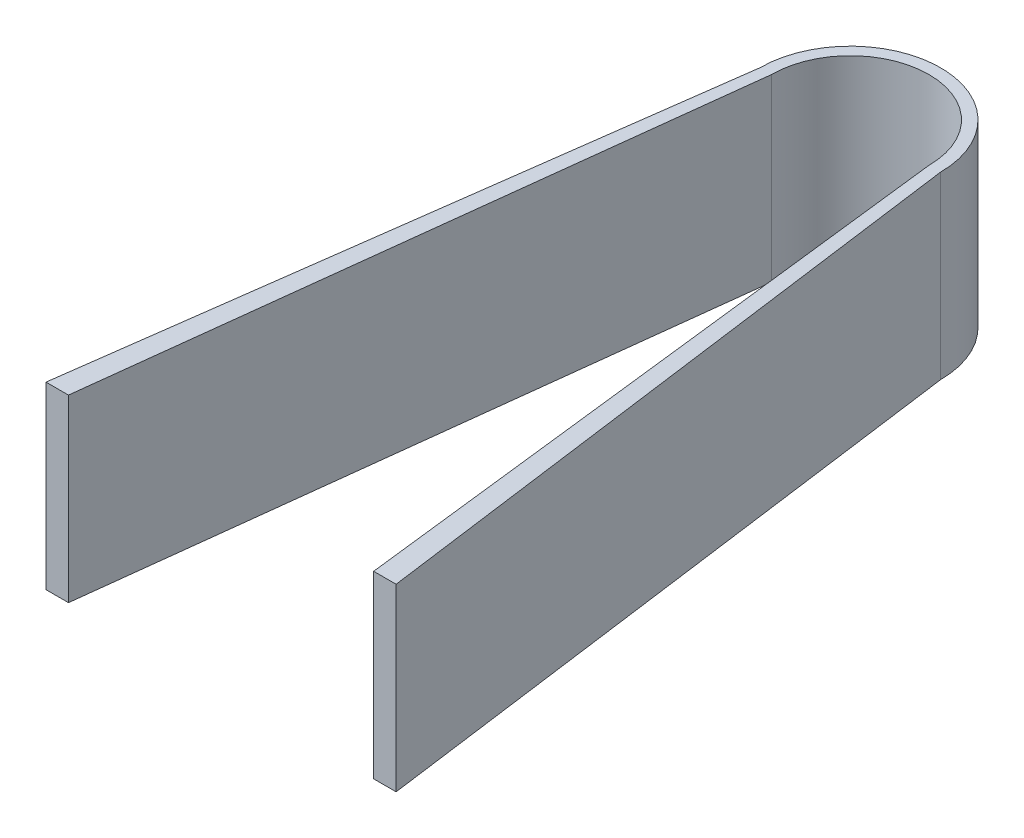
ISO-10303-21;
HEADER;
FILE_DESCRIPTION(('STEP AP214'),'2;1');
FILE_NAME('part.step','',(''),(''),'','','');
FILE_SCHEMA(('AUTOMOTIVE_DESIGN { 1 0 10303 214 1 1 1 1 }'));
ENDSEC;
DATA;
#1=APPLICATION_CONTEXT('core data for automotive mechanical design processes');
#2=APPLICATION_PROTOCOL_DEFINITION('international standard','automotive_design',2000,#1);
#3=PRODUCT_CONTEXT('',#1,'mechanical');
#4=PRODUCT('Part','Part','',(#3));
#5=PRODUCT_RELATED_PRODUCT_CATEGORY('part','',(#4));
#6=PRODUCT_DEFINITION_FORMATION('','',#4);
#7=PRODUCT_DEFINITION_CONTEXT('part definition',#1,'design');
#8=PRODUCT_DEFINITION('design','',#6,#7);
#9=PRODUCT_DEFINITION_SHAPE('','',#8);
#10=(LENGTH_UNIT() NAMED_UNIT(*) SI_UNIT(.MILLI.,.METRE.));
#11=(NAMED_UNIT(*) PLANE_ANGLE_UNIT() SI_UNIT($,.RADIAN.));
#12=(NAMED_UNIT(*) SI_UNIT($,.STERADIAN.) SOLID_ANGLE_UNIT());
#13=UNCERTAINTY_MEASURE_WITH_UNIT(LENGTH_MEASURE(1.E-05),#10,'distance_accuracy_value','');
#14=(GEOMETRIC_REPRESENTATION_CONTEXT(3) GLOBAL_UNCERTAINTY_ASSIGNED_CONTEXT((#13)) GLOBAL_UNIT_ASSIGNED_CONTEXT((#10,
#11,#12)) REPRESENTATION_CONTEXT('',''));
#15=CARTESIAN_POINT('',(0.,0.,0.));
#16=DIRECTION('',(0.,0.,1.));
#17=DIRECTION('',(1.,0.,0.));
#18=AXIS2_PLACEMENT_3D('',#15,#16,#17);
#19=CARTESIAN_POINT('',(0.,25.4,0.));
#20=DIRECTION('',(0.,-1.,0.));
#21=DIRECTION('',(0.,0.,-1.));
#22=AXIS2_PLACEMENT_3D('',#19,#20,#21);
#23=CYLINDRICAL_SURFACE('',#22,11.1125);
#24=CARTESIAN_POINT('',(0.,0.,0.));
#25=DIRECTION('',(0.,-1.,0.));
#26=DIRECTION('',(0.,0.,1.));
#27=AXIS2_PLACEMENT_3D('',#24,#25,#26);
#28=CIRCLE('',#27,11.1125);
#29=CARTESIAN_POINT('',(-11.1125,0.,0.));
#30=VERTEX_POINT('',#29);
#31=CARTESIAN_POINT('',(11.1125,0.,0.));
#32=VERTEX_POINT('',#31);
#33=EDGE_CURVE('E129',#30,#32,#28,.T.);
#34=ORIENTED_EDGE('',*,*,#33,.T.);
#35=DIRECTION('',(0.,-1.,0.));
#36=VECTOR('',#35,1.);
#37=CARTESIAN_POINT('',(11.1125,25.4,0.));
#38=LINE('',#37,#36);
#39=CARTESIAN_POINT('',(11.1125,25.4,0.));
#40=VERTEX_POINT('',#39);
#41=EDGE_CURVE('E11',#40,#32,#38,.T.);
#42=ORIENTED_EDGE('',*,*,#41,.F.);
#43=CARTESIAN_POINT('',(0.,25.4,0.));
#44=DIRECTION('',(0.,-1.,0.));
#45=DIRECTION('',(0.,0.,1.));
#46=AXIS2_PLACEMENT_3D('',#43,#44,#45);
#47=CIRCLE('',#46,11.1125);
#48=CARTESIAN_POINT('',(-11.1125,25.4,0.));
#49=VERTEX_POINT('',#48);
#50=EDGE_CURVE('E143',#49,#40,#47,.T.);
#51=ORIENTED_EDGE('',*,*,#50,.F.);
#52=DIRECTION('',(0.,-1.,0.));
#53=VECTOR('',#52,1.);
#54=CARTESIAN_POINT('',(-11.1125,25.4,0.));
#55=LINE('',#54,#53);
#56=EDGE_CURVE('E125',#49,#30,#55,.T.);
#57=ORIENTED_EDGE('',*,*,#56,.T.);
#58=EDGE_LOOP('',(#34,#42,#51,#57));
#59=FACE_BOUND('',#58,.T.);
#60=ADVANCED_FACE('F33',(#59),#23,.F.);
#61=CARTESIAN_POINT('',(11.1125,25.4,0.));
#62=DIRECTION('',(0.993167653486563,0.,-0.116696238448349));
#63=DIRECTION('',(-0.116696238448349,0.,-0.993167653486563));
#64=AXIS2_PLACEMENT_3D('',#61,#62,#63);
#65=PLANE('',#64);
#66=DIRECTION('',(0.116696238448349,0.,0.993167653486563));
#67=VECTOR('',#66,1.);
#68=CARTESIAN_POINT('',(11.1125,0.,0.));
#69=LINE('',#68,#67);
#70=CARTESIAN_POINT('',(21.558031072894,0.,88.8988687469892));
#71=VERTEX_POINT('',#70);
#72=EDGE_CURVE('E132',#32,#71,#69,.T.);
#73=ORIENTED_EDGE('',*,*,#72,.T.);
#74=DIRECTION('',(0.,-1.,0.));
#75=VECTOR('',#74,1.);
#76=CARTESIAN_POINT('',(21.558031072894,25.4,88.8988687469892));
#77=LINE('',#76,#75);
#78=CARTESIAN_POINT('',(21.558031072894,25.4,88.8988687469892));
#79=VERTEX_POINT('',#78);
#80=EDGE_CURVE('E41',#79,#71,#77,.T.);
#81=ORIENTED_EDGE('',*,*,#80,.F.);
#82=DIRECTION('',(0.116696238448349,0.,0.993167653486563));
#83=VECTOR('',#82,1.);
#84=CARTESIAN_POINT('',(11.1125,25.4,0.));
#85=LINE('',#84,#83);
#86=EDGE_CURVE('E92',#40,#79,#85,.T.);
#87=ORIENTED_EDGE('',*,*,#86,.F.);
#88=ORIENTED_EDGE('',*,*,#41,.T.);
#89=EDGE_LOOP('',(#73,#81,#87,#88));
#90=FACE_BOUND('',#89,.T.);
#91=ADVANCED_FACE('F178',(#90),#65,.F.);
#92=CARTESIAN_POINT('',(21.558031072894,25.4,88.8988687469892));
#93=DIRECTION('',(0.,0.,-1.));
#94=DIRECTION('',(-1.,0.,0.));
#95=AXIS2_PLACEMENT_3D('',#92,#93,#94);
#96=PLANE('',#95);
#97=DIRECTION('',(1.,0.,0.));
#98=VECTOR('',#97,1.);
#99=CARTESIAN_POINT('',(21.558031072894,0.,88.8988687469892));
#100=LINE('',#99,#98);
#101=CARTESIAN_POINT('',(24.733031072894,0.,88.8988687469892));
#102=VERTEX_POINT('',#101);
#103=EDGE_CURVE('E134',#71,#102,#100,.T.);
#104=ORIENTED_EDGE('',*,*,#103,.T.);
#105=DIRECTION('',(0.,-1.,0.));
#106=VECTOR('',#105,1.);
#107=CARTESIAN_POINT('',(24.733031072894,25.4,88.8988687469892));
#108=LINE('',#107,#106);
#109=CARTESIAN_POINT('',(24.733031072894,25.4,88.8988687469892));
#110=VERTEX_POINT('',#109);
#111=EDGE_CURVE('E150',#110,#102,#108,.T.);
#112=ORIENTED_EDGE('',*,*,#111,.F.);
#113=DIRECTION('',(1.,0.,0.));
#114=VECTOR('',#113,1.);
#115=CARTESIAN_POINT('',(21.558031072894,25.4,88.8988687469892));
#116=LINE('',#115,#114);
#117=EDGE_CURVE('E158',#79,#110,#116,.T.);
#118=ORIENTED_EDGE('',*,*,#117,.F.);
#119=ORIENTED_EDGE('',*,*,#80,.T.);
#120=EDGE_LOOP('',(#104,#112,#118,#119));
#121=FACE_BOUND('',#120,.T.);
#122=ADVANCED_FACE('F156',(#121),#96,.F.);
#123=CARTESIAN_POINT('',(12.7635,25.4,0.));
#124=DIRECTION('',(-0.991057159550519,0.,0.133438024954123));
#125=DIRECTION('',(0.133438024954123,0.,0.991057159550519));
#126=AXIS2_PLACEMENT_3D('',#123,#124,#125);
#127=PLANE('',#126);
#128=DIRECTION('',(-0.133438024954123,0.,-0.991057159550519));
#129=VECTOR('',#128,1.);
#130=CARTESIAN_POINT('',(12.7635,0.,0.));
#131=LINE('',#130,#129);
#132=CARTESIAN_POINT('',(12.7635,0.,0.));
#133=VERTEX_POINT('',#132);
#134=EDGE_CURVE('E136',#102,#133,#131,.T.);
#135=ORIENTED_EDGE('',*,*,#134,.T.);
#136=DIRECTION('',(0.,-1.,0.));
#137=VECTOR('',#136,1.);
#138=CARTESIAN_POINT('',(12.7635,25.4,0.));
#139=LINE('',#138,#137);
#140=CARTESIAN_POINT('',(12.7635,25.4,0.));
#141=VERTEX_POINT('',#140);
#142=EDGE_CURVE('E147',#141,#133,#139,.T.);
#143=ORIENTED_EDGE('',*,*,#142,.F.);
#144=DIRECTION('',(-0.133438024954123,0.,-0.991057159550519));
#145=VECTOR('',#144,1.);
#146=CARTESIAN_POINT('',(12.7635,25.4,0.));
#147=LINE('',#146,#145);
#148=EDGE_CURVE('E170',#110,#141,#147,.T.);
#149=ORIENTED_EDGE('',*,*,#148,.F.);
#150=ORIENTED_EDGE('',*,*,#111,.T.);
#151=EDGE_LOOP('',(#135,#143,#149,#150));
#152=FACE_BOUND('',#151,.T.);
#153=ADVANCED_FACE('F166',(#152),#127,.F.);
#154=CARTESIAN_POINT('',(0.,25.4,0.));
#155=DIRECTION('',(0.,-1.,0.));
#156=DIRECTION('',(0.,0.,-1.));
#157=AXIS2_PLACEMENT_3D('',#154,#155,#156);
#158=CYLINDRICAL_SURFACE('',#157,12.7635);
#159=CARTESIAN_POINT('',(0.,0.,0.));
#160=DIRECTION('',(0.,1.,0.));
#161=DIRECTION('',(0.,0.,1.));
#162=AXIS2_PLACEMENT_3D('',#159,#160,#161);
#163=CIRCLE('',#162,12.7635);
#164=CARTESIAN_POINT('',(-12.7635,0.,0.));
#165=VERTEX_POINT('',#164);
#166=EDGE_CURVE('E138',#133,#165,#163,.T.);
#167=ORIENTED_EDGE('',*,*,#166,.T.);
#168=DIRECTION('',(0.,-1.,0.));
#169=VECTOR('',#168,1.);
#170=CARTESIAN_POINT('',(-12.7635,25.4,0.));
#171=LINE('',#170,#169);
#172=CARTESIAN_POINT('',(-12.7635,25.4,0.));
#173=VERTEX_POINT('',#172);
#174=EDGE_CURVE('E120',#173,#165,#171,.T.);
#175=ORIENTED_EDGE('',*,*,#174,.F.);
#176=CARTESIAN_POINT('',(0.,25.4,0.));
#177=DIRECTION('',(0.,1.,0.));
#178=DIRECTION('',(0.,0.,1.));
#179=AXIS2_PLACEMENT_3D('',#176,#177,#178);
#180=CIRCLE('',#179,12.7635);
#181=EDGE_CURVE('E111',#141,#173,#180,.T.);
#182=ORIENTED_EDGE('',*,*,#181,.F.);
#183=ORIENTED_EDGE('',*,*,#142,.T.);
#184=EDGE_LOOP('',(#167,#175,#182,#183));
#185=FACE_BOUND('',#184,.T.);
#186=ADVANCED_FACE('F169',(#185),#158,.T.);
#187=CARTESIAN_POINT('',(-12.7635,25.4,0.));
#188=DIRECTION('',(0.991057159550519,0.,0.133438024954123));
#189=DIRECTION('',(0.133438024954123,0.,-0.991057159550519));
#190=AXIS2_PLACEMENT_3D('',#187,#188,#189);
#191=PLANE('',#190);
#192=DIRECTION('',(-0.133438024954123,0.,0.991057159550519));
#193=VECTOR('',#192,1.);
#194=CARTESIAN_POINT('',(-12.7635,0.,0.));
#195=LINE('',#194,#193);
#196=CARTESIAN_POINT('',(-24.733031072894,0.,88.8988687469892));
#197=VERTEX_POINT('',#196);
#198=EDGE_CURVE('E119',#165,#197,#195,.T.);
#199=ORIENTED_EDGE('',*,*,#198,.T.);
#200=DIRECTION('',(0.,-1.,0.));
#201=VECTOR('',#200,1.);
#202=CARTESIAN_POINT('',(-24.733031072894,25.4,88.8988687469892));
#203=LINE('',#202,#201);
#204=CARTESIAN_POINT('',(-24.733031072894,25.4,88.8988687469892));
#205=VERTEX_POINT('',#204);
#206=EDGE_CURVE('E116',#205,#197,#203,.T.);
#207=ORIENTED_EDGE('',*,*,#206,.F.);
#208=DIRECTION('',(-0.133438024954123,0.,0.991057159550519));
#209=VECTOR('',#208,1.);
#210=CARTESIAN_POINT('',(-12.7635,25.4,0.));
#211=LINE('',#210,#209);
#212=EDGE_CURVE('E105',#173,#205,#211,.T.);
#213=ORIENTED_EDGE('',*,*,#212,.F.);
#214=ORIENTED_EDGE('',*,*,#174,.T.);
#215=EDGE_LOOP('',(#199,#207,#213,#214));
#216=FACE_BOUND('',#215,.T.);
#217=ADVANCED_FACE('F117',(#216),#191,.F.);
#218=CARTESIAN_POINT('',(-24.733031072894,25.4,88.8988687469892));
#219=DIRECTION('',(0.,0.,-1.));
#220=DIRECTION('',(-1.,0.,0.));
#221=AXIS2_PLACEMENT_3D('',#218,#219,#220);
#222=PLANE('',#221);
#223=DIRECTION('',(1.,0.,0.));
#224=VECTOR('',#223,1.);
#225=CARTESIAN_POINT('',(-24.733031072894,0.,88.8988687469892));
#226=LINE('',#225,#224);
#227=CARTESIAN_POINT('',(-21.558031072894,0.,88.8988687469892));
#228=VERTEX_POINT('',#227);
#229=EDGE_CURVE('E78',#197,#228,#226,.T.);
#230=ORIENTED_EDGE('',*,*,#229,.T.);
#231=DIRECTION('',(0.,-1.,0.));
#232=VECTOR('',#231,1.);
#233=CARTESIAN_POINT('',(-21.558031072894,25.4,88.8988687469892));
#234=LINE('',#233,#232);
#235=CARTESIAN_POINT('',(-21.558031072894,25.4,88.8988687469892));
#236=VERTEX_POINT('',#235);
#237=EDGE_CURVE('E121',#236,#228,#234,.T.);
#238=ORIENTED_EDGE('',*,*,#237,.F.);
#239=DIRECTION('',(1.,0.,0.));
#240=VECTOR('',#239,1.);
#241=CARTESIAN_POINT('',(-24.733031072894,25.4,88.8988687469892));
#242=LINE('',#241,#240);
#243=EDGE_CURVE('E109',#205,#236,#242,.T.);
#244=ORIENTED_EDGE('',*,*,#243,.F.);
#245=ORIENTED_EDGE('',*,*,#206,.T.);
#246=EDGE_LOOP('',(#230,#238,#244,#245));
#247=FACE_BOUND('',#246,.T.);
#248=ADVANCED_FACE('F123',(#247),#222,.F.);
#249=CARTESIAN_POINT('',(-11.1125,25.4,0.));
#250=DIRECTION('',(-0.993167653486563,0.,-0.116696238448349));
#251=DIRECTION('',(-0.116696238448349,0.,0.993167653486563));
#252=AXIS2_PLACEMENT_3D('',#249,#250,#251);
#253=PLANE('',#252);
#254=DIRECTION('',(0.116696238448349,0.,-0.993167653486563));
#255=VECTOR('',#254,1.);
#256=CARTESIAN_POINT('',(-11.1125,0.,0.));
#257=LINE('',#256,#255);
#258=EDGE_CURVE('E84',#228,#30,#257,.T.);
#259=ORIENTED_EDGE('',*,*,#258,.T.);
#260=ORIENTED_EDGE('',*,*,#56,.F.);
#261=DIRECTION('',(0.116696238448349,0.,-0.993167653486563));
#262=VECTOR('',#261,1.);
#263=CARTESIAN_POINT('',(-11.1125,25.4,0.));
#264=LINE('',#263,#262);
#265=EDGE_CURVE('E49',#236,#49,#264,.T.);
#266=ORIENTED_EDGE('',*,*,#265,.F.);
#267=ORIENTED_EDGE('',*,*,#237,.T.);
#268=EDGE_LOOP('',(#259,#260,#266,#267));
#269=FACE_BOUND('',#268,.T.);
#270=ADVANCED_FACE('F194',(#269),#253,.F.);
#271=CARTESIAN_POINT('',(0.,25.4,0.));
#272=DIRECTION('',(0.,1.,0.));
#273=DIRECTION('',(0.,0.,1.));
#274=AXIS2_PLACEMENT_3D('',#271,#272,#273);
#275=PLANE('',#274);
#276=ORIENTED_EDGE('',*,*,#50,.T.);
#277=ORIENTED_EDGE('',*,*,#86,.T.);
#278=ORIENTED_EDGE('',*,*,#117,.T.);
#279=ORIENTED_EDGE('',*,*,#148,.T.);
#280=ORIENTED_EDGE('',*,*,#181,.T.);
#281=ORIENTED_EDGE('',*,*,#212,.T.);
#282=ORIENTED_EDGE('',*,*,#243,.T.);
#283=ORIENTED_EDGE('',*,*,#265,.T.);
#284=EDGE_LOOP('',(#276,#277,#278,#279,#280,#281,#282,#283));
#285=FACE_BOUND('',#284,.T.);
#286=ADVANCED_FACE('F107',(#285),#275,.T.);
#287=CARTESIAN_POINT('',(0.,0.,0.));
#288=DIRECTION('',(0.,1.,0.));
#289=DIRECTION('',(0.,0.,1.));
#290=AXIS2_PLACEMENT_3D('',#287,#288,#289);
#291=PLANE('',#290);
#292=ORIENTED_EDGE('',*,*,#33,.F.);
#293=ORIENTED_EDGE('',*,*,#258,.F.);
#294=ORIENTED_EDGE('',*,*,#229,.F.);
#295=ORIENTED_EDGE('',*,*,#198,.F.);
#296=ORIENTED_EDGE('',*,*,#166,.F.);
#297=ORIENTED_EDGE('',*,*,#134,.F.);
#298=ORIENTED_EDGE('',*,*,#103,.F.);
#299=ORIENTED_EDGE('',*,*,#72,.F.);
#300=EDGE_LOOP('',(#292,#293,#294,#295,#296,#297,#298,#299));
#301=FACE_BOUND('',#300,.T.);
#302=ADVANCED_FACE('F162',(#301),#291,.F.);
#303=CLOSED_SHELL('',(#60,#91,#122,#153,#186,#217,#248,#270,#286,#302));
#304=MANIFOLD_SOLID_BREP('B2',#303);
#305=ADVANCED_BREP_SHAPE_REPRESENTATION('',(#18,#304),#14);
#306=SHAPE_DEFINITION_REPRESENTATION(#9,#305);
ENDSEC;
END-ISO-10303-21;
